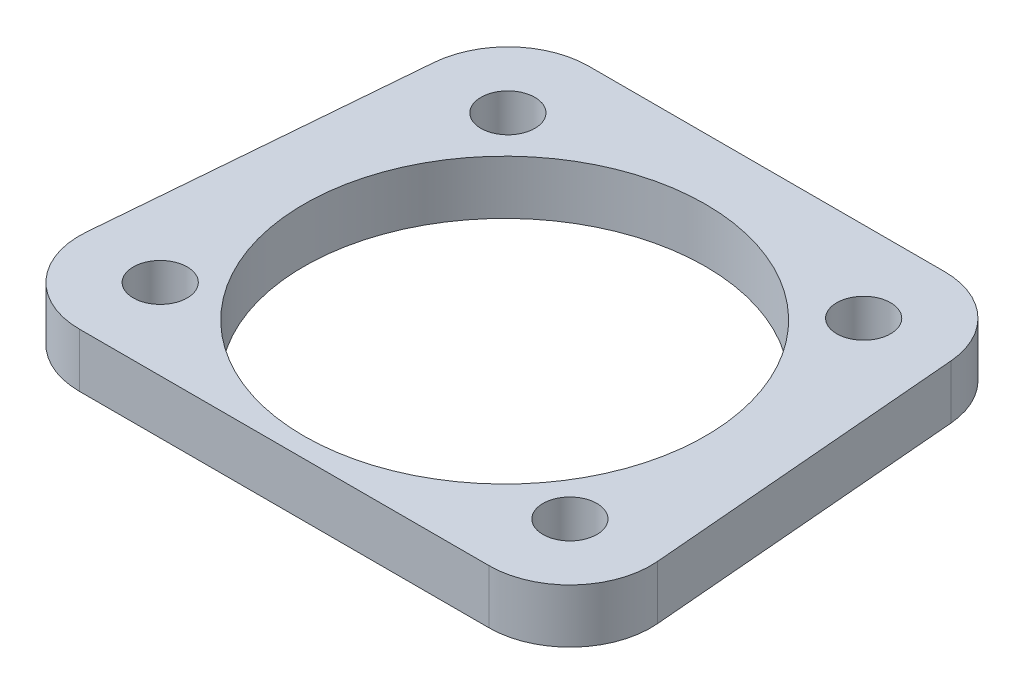
ISO-10303-21;
HEADER;
FILE_DESCRIPTION(('STEP AP214'),'2;1');
FILE_NAME('part.step','',(''),(''),'','','');
FILE_SCHEMA(('AUTOMOTIVE_DESIGN { 1 0 10303 214 1 1 1 1 }'));
ENDSEC;
DATA;
#1=APPLICATION_CONTEXT('core data for automotive mechanical design processes');
#2=APPLICATION_PROTOCOL_DEFINITION('international standard','automotive_design',2000,#1);
#3=PRODUCT_CONTEXT('',#1,'mechanical');
#4=PRODUCT('Part','Part','',(#3));
#5=PRODUCT_RELATED_PRODUCT_CATEGORY('part','',(#4));
#6=PRODUCT_DEFINITION_FORMATION('','',#4);
#7=PRODUCT_DEFINITION_CONTEXT('part definition',#1,'design');
#8=PRODUCT_DEFINITION('design','',#6,#7);
#9=PRODUCT_DEFINITION_SHAPE('','',#8);
#10=(LENGTH_UNIT() NAMED_UNIT(*) SI_UNIT(.MILLI.,.METRE.));
#11=(NAMED_UNIT(*) PLANE_ANGLE_UNIT() SI_UNIT($,.RADIAN.));
#12=(NAMED_UNIT(*) SI_UNIT($,.STERADIAN.) SOLID_ANGLE_UNIT());
#13=UNCERTAINTY_MEASURE_WITH_UNIT(LENGTH_MEASURE(1.E-05),#10,'distance_accuracy_value','');
#14=(GEOMETRIC_REPRESENTATION_CONTEXT(3) GLOBAL_UNCERTAINTY_ASSIGNED_CONTEXT((#13)) GLOBAL_UNIT_ASSIGNED_CONTEXT((#10,
#11,#12)) REPRESENTATION_CONTEXT('',''));
#15=CARTESIAN_POINT('',(0.,0.,0.));
#16=DIRECTION('',(0.,0.,1.));
#17=DIRECTION('',(1.,0.,0.));
#18=AXIS2_PLACEMENT_3D('',#15,#16,#17);
#19=CARTESIAN_POINT('',(-50.2691426447939,10.,-4.22498993905971));
#20=DIRECTION('',(0.996486621477541,0.,0.0837520938023445));
#21=DIRECTION('',(0.0837520938023445,0.,-0.996486621477541));
#22=AXIS2_PLACEMENT_3D('',#19,#20,#21);
#23=PLANE('',#22);
#24=DIRECTION('',(-0.0837520938023445,0.,0.996486621477541));
#25=VECTOR('',#24,1.);
#26=CARTESIAN_POINT('',(-50.2691426447939,0.,-4.22498993905971));
#27=LINE('',#26,#25);
#28=CARTESIAN_POINT('',(-47.9472993221631,0.,-31.8503984885919));
#29=VERTEX_POINT('',#28);
#30=CARTESIAN_POINT('',(-52.9472993221631,0.,27.6398528136173));
#31=VERTEX_POINT('',#30);
#32=EDGE_CURVE('E145',#29,#31,#27,.T.);
#33=ORIENTED_EDGE('',*,*,#32,.T.);
#34=DIRECTION('',(0.,-1.,0.));
#35=VECTOR('',#34,1.);
#36=CARTESIAN_POINT('',(-52.9472993221631,10.,27.6398528136173));
#37=LINE('',#36,#35);
#38=CARTESIAN_POINT('',(-52.9472993221631,10.,27.6398528136173));
#39=VERTEX_POINT('',#38);
#40=EDGE_CURVE('E11',#39,#31,#37,.T.);
#41=ORIENTED_EDGE('',*,*,#40,.F.);
#42=DIRECTION('',(-0.0837520938023445,0.,0.996486621477541));
#43=VECTOR('',#42,1.);
#44=CARTESIAN_POINT('',(-50.2691426447939,10.,-4.22498993905971));
#45=LINE('',#44,#43);
#46=CARTESIAN_POINT('',(-47.9472993221631,10.,-31.8503984885919));
#47=VERTEX_POINT('',#46);
#48=EDGE_CURVE('E191',#47,#39,#45,.T.);
#49=ORIENTED_EDGE('',*,*,#48,.F.);
#50=DIRECTION('',(0.,-1.,0.));
#51=VECTOR('',#50,1.);
#52=CARTESIAN_POINT('',(-47.9472993221631,10.,-31.8503984885919));
#53=LINE('',#52,#51);
#54=EDGE_CURVE('E126',#47,#29,#53,.T.);
#55=ORIENTED_EDGE('',*,*,#54,.T.);
#56=EDGE_LOOP('',(#33,#41,#49,#55));
#57=FACE_BOUND('',#56,.T.);
#58=ADVANCED_FACE('F35',(#57),#23,.F.);
#59=CARTESIAN_POINT('',(-38.,10.,28.8961342206525));
#60=DIRECTION('',(0.,-1.,0.));
#61=DIRECTION('',(0.,0.,-1.));
#62=AXIS2_PLACEMENT_3D('',#59,#60,#61);
#63=CYLINDRICAL_SURFACE('',#62,15.);
#64=CARTESIAN_POINT('',(-38.,0.,28.8961342206525));
#65=DIRECTION('',(0.,1.,0.));
#66=DIRECTION('',(0.,0.,1.));
#67=AXIS2_PLACEMENT_3D('',#64,#65,#66);
#68=CIRCLE('',#67,15.);
#69=CARTESIAN_POINT('',(-38.,0.,43.8961342206525));
#70=VERTEX_POINT('',#69);
#71=EDGE_CURVE('E148',#31,#70,#68,.T.);
#72=ORIENTED_EDGE('',*,*,#71,.T.);
#73=DIRECTION('',(0.,-1.,0.));
#74=VECTOR('',#73,1.);
#75=CARTESIAN_POINT('',(-38.,10.,43.8961342206525));
#76=LINE('',#75,#74);
#77=CARTESIAN_POINT('',(-38.,10.,43.8961342206525));
#78=VERTEX_POINT('',#77);
#79=EDGE_CURVE('E44',#78,#70,#76,.T.);
#80=ORIENTED_EDGE('',*,*,#79,.F.);
#81=CARTESIAN_POINT('',(-38.,10.,28.8961342206525));
#82=DIRECTION('',(0.,1.,0.));
#83=DIRECTION('',(0.,0.,1.));
#84=AXIS2_PLACEMENT_3D('',#81,#82,#83);
#85=CIRCLE('',#84,15.);
#86=EDGE_CURVE('E91',#39,#78,#85,.T.);
#87=ORIENTED_EDGE('',*,*,#86,.F.);
#88=ORIENTED_EDGE('',*,*,#40,.T.);
#89=EDGE_LOOP('',(#72,#80,#87,#88));
#90=FACE_BOUND('',#89,.T.);
#91=ADVANCED_FACE('F237',(#90),#63,.T.);
#92=CARTESIAN_POINT('',(0.,10.,43.8961342206525));
#93=DIRECTION('',(0.,0.,-1.));
#94=DIRECTION('',(-1.,0.,0.));
#95=AXIS2_PLACEMENT_3D('',#92,#93,#94);
#96=PLANE('',#95);
#97=DIRECTION('',(1.,0.,0.));
#98=VECTOR('',#97,1.);
#99=CARTESIAN_POINT('',(0.,0.,43.8961342206525));
#100=LINE('',#99,#98);
#101=CARTESIAN_POINT('',(38.,0.,43.8961342206525));
#102=VERTEX_POINT('',#101);
#103=EDGE_CURVE('E150',#70,#102,#100,.T.);
#104=ORIENTED_EDGE('',*,*,#103,.T.);
#105=DIRECTION('',(0.,-1.,0.));
#106=VECTOR('',#105,1.);
#107=CARTESIAN_POINT('',(38.,10.,43.8961342206525));
#108=LINE('',#107,#106);
#109=CARTESIAN_POINT('',(38.,10.,43.8961342206525));
#110=VERTEX_POINT('',#109);
#111=EDGE_CURVE('E168',#110,#102,#108,.T.);
#112=ORIENTED_EDGE('',*,*,#111,.F.);
#113=DIRECTION('',(1.,0.,0.));
#114=VECTOR('',#113,1.);
#115=CARTESIAN_POINT('',(0.,10.,43.8961342206525));
#116=LINE('',#115,#114);
#117=EDGE_CURVE('E176',#78,#110,#116,.T.);
#118=ORIENTED_EDGE('',*,*,#117,.F.);
#119=ORIENTED_EDGE('',*,*,#79,.T.);
#120=EDGE_LOOP('',(#104,#112,#118,#119));
#121=FACE_BOUND('',#120,.T.);
#122=ADVANCED_FACE('F174',(#121),#96,.F.);
#123=CARTESIAN_POINT('',(38.,10.,28.8961342206525));
#124=DIRECTION('',(0.,-1.,0.));
#125=DIRECTION('',(0.,0.,-1.));
#126=AXIS2_PLACEMENT_3D('',#123,#124,#125);
#127=CYLINDRICAL_SURFACE('',#126,15.);
#128=CARTESIAN_POINT('',(38.,0.,28.8961342206525));
#129=DIRECTION('',(0.,1.,0.));
#130=DIRECTION('',(0.,0.,1.));
#131=AXIS2_PLACEMENT_3D('',#128,#129,#130);
#132=CIRCLE('',#131,15.);
#133=CARTESIAN_POINT('',(52.9472993221631,0.,27.6398528136173));
#134=VERTEX_POINT('',#133);
#135=EDGE_CURVE('E152',#102,#134,#132,.T.);
#136=ORIENTED_EDGE('',*,*,#135,.T.);
#137=DIRECTION('',(0.,-1.,0.));
#138=VECTOR('',#137,1.);
#139=CARTESIAN_POINT('',(52.9472993221631,10.,27.6398528136173));
#140=LINE('',#139,#138);
#141=CARTESIAN_POINT('',(52.9472993221631,10.,27.6398528136173));
#142=VERTEX_POINT('',#141);
#143=EDGE_CURVE('E166',#142,#134,#140,.T.);
#144=ORIENTED_EDGE('',*,*,#143,.F.);
#145=CARTESIAN_POINT('',(38.,10.,28.8961342206525));
#146=DIRECTION('',(0.,1.,0.));
#147=DIRECTION('',(0.,0.,1.));
#148=AXIS2_PLACEMENT_3D('',#145,#146,#147);
#149=CIRCLE('',#148,15.);
#150=EDGE_CURVE('E186',#110,#142,#149,.T.);
#151=ORIENTED_EDGE('',*,*,#150,.F.);
#152=ORIENTED_EDGE('',*,*,#111,.T.);
#153=EDGE_LOOP('',(#136,#144,#151,#152));
#154=FACE_BOUND('',#153,.T.);
#155=ADVANCED_FACE('F184',(#154),#127,.T.);
#156=CARTESIAN_POINT('',(50.2691426447939,10.,-4.22498993905974));
#157=DIRECTION('',(0.996486621477541,0.,-0.0837520938023451));
#158=DIRECTION('',(-0.0837520938023451,0.,-0.996486621477541));
#159=AXIS2_PLACEMENT_3D('',#156,#157,#158);
#160=PLANE('',#159);
#161=DIRECTION('',(0.0837520938023451,0.,0.996486621477541));
#162=VECTOR('',#161,1.);
#163=CARTESIAN_POINT('',(50.2691426447939,0.,-4.22498993905974));
#164=LINE('',#163,#162);
#165=CARTESIAN_POINT('',(47.9472993221631,0.,-31.8503984885919));
#166=VERTEX_POINT('',#165);
#167=EDGE_CURVE('E155',#166,#134,#164,.T.);
#168=ORIENTED_EDGE('',*,*,#167,.F.);
#169=DIRECTION('',(0.,-1.,0.));
#170=VECTOR('',#169,1.);
#171=CARTESIAN_POINT('',(47.9472993221631,10.,-31.8503984885919));
#172=LINE('',#171,#170);
#173=CARTESIAN_POINT('',(47.9472993221631,10.,-31.8503984885919));
#174=VERTEX_POINT('',#173);
#175=EDGE_CURVE('E122',#174,#166,#172,.T.);
#176=ORIENTED_EDGE('',*,*,#175,.F.);
#177=DIRECTION('',(0.0837520938023451,0.,0.996486621477541));
#178=VECTOR('',#177,1.);
#179=CARTESIAN_POINT('',(50.2691426447939,10.,-4.22498993905974));
#180=LINE('',#179,#178);
#181=EDGE_CURVE('E111',#174,#142,#180,.T.);
#182=ORIENTED_EDGE('',*,*,#181,.T.);
#183=ORIENTED_EDGE('',*,*,#143,.T.);
#184=EDGE_LOOP('',(#168,#176,#182,#183));
#185=FACE_BOUND('',#184,.T.);
#186=ADVANCED_FACE('F276',(#185),#160,.T.);
#187=CARTESIAN_POINT('',(33.,10.,-30.5941170815567));
#188=DIRECTION('',(0.,-1.,0.));
#189=DIRECTION('',(0.,0.,-1.));
#190=AXIS2_PLACEMENT_3D('',#187,#188,#189);
#191=CYLINDRICAL_SURFACE('',#190,15.);
#192=CARTESIAN_POINT('',(33.,0.,-30.5941170815567));
#193=DIRECTION('',(0.,1.,0.));
#194=DIRECTION('',(0.,0.,1.));
#195=AXIS2_PLACEMENT_3D('',#192,#193,#194);
#196=CIRCLE('',#195,15.);
#197=CARTESIAN_POINT('',(33.,0.,-45.5941170815567));
#198=VERTEX_POINT('',#197);
#199=EDGE_CURVE('E118',#166,#198,#196,.T.);
#200=ORIENTED_EDGE('',*,*,#199,.T.);
#201=DIRECTION('',(0.,-1.,0.));
#202=VECTOR('',#201,1.);
#203=CARTESIAN_POINT('',(33.,10.,-45.5941170815567));
#204=LINE('',#203,#202);
#205=CARTESIAN_POINT('',(33.,10.,-45.5941170815567));
#206=VERTEX_POINT('',#205);
#207=EDGE_CURVE('E115',#206,#198,#204,.T.);
#208=ORIENTED_EDGE('',*,*,#207,.F.);
#209=CARTESIAN_POINT('',(33.,10.,-30.5941170815567));
#210=DIRECTION('',(0.,1.,0.));
#211=DIRECTION('',(0.,0.,1.));
#212=AXIS2_PLACEMENT_3D('',#209,#210,#211);
#213=CIRCLE('',#212,15.);
#214=EDGE_CURVE('E105',#174,#206,#213,.T.);
#215=ORIENTED_EDGE('',*,*,#214,.F.);
#216=ORIENTED_EDGE('',*,*,#175,.T.);
#217=EDGE_LOOP('',(#200,#208,#215,#216));
#218=FACE_BOUND('',#217,.T.);
#219=ADVANCED_FACE('F116',(#218),#191,.T.);
#220=CARTESIAN_POINT('',(0.,10.,-45.5941170815567));
#221=DIRECTION('',(0.,0.,-1.));
#222=DIRECTION('',(-1.,0.,0.));
#223=AXIS2_PLACEMENT_3D('',#220,#221,#222);
#224=PLANE('',#223);
#225=DIRECTION('',(1.,0.,0.));
#226=VECTOR('',#225,1.);
#227=CARTESIAN_POINT('',(0.,0.,-45.5941170815567));
#228=LINE('',#227,#226);
#229=CARTESIAN_POINT('',(-33.,0.,-45.5941170815567));
#230=VERTEX_POINT('',#229);
#231=EDGE_CURVE('E159',#230,#198,#228,.T.);
#232=ORIENTED_EDGE('',*,*,#231,.F.);
#233=DIRECTION('',(0.,-1.,0.));
#234=VECTOR('',#233,1.);
#235=CARTESIAN_POINT('',(-33.,10.,-45.5941170815567));
#236=LINE('',#235,#234);
#237=CARTESIAN_POINT('',(-33.,10.,-45.5941170815567));
#238=VERTEX_POINT('',#237);
#239=EDGE_CURVE('E80',#238,#230,#236,.T.);
#240=ORIENTED_EDGE('',*,*,#239,.F.);
#241=DIRECTION('',(1.,0.,0.));
#242=VECTOR('',#241,1.);
#243=CARTESIAN_POINT('',(0.,10.,-45.5941170815567));
#244=LINE('',#243,#242);
#245=EDGE_CURVE('E109',#238,#206,#244,.T.);
#246=ORIENTED_EDGE('',*,*,#245,.T.);
#247=ORIENTED_EDGE('',*,*,#207,.T.);
#248=EDGE_LOOP('',(#232,#240,#246,#247));
#249=FACE_BOUND('',#248,.T.);
#250=ADVANCED_FACE('F124',(#249),#224,.T.);
#251=CARTESIAN_POINT('',(-38.,10.,28.8961342206525));
#252=DIRECTION('',(0.,-1.,0.));
#253=DIRECTION('',(0.,0.,-1.));
#254=AXIS2_PLACEMENT_3D('',#251,#252,#253);
#255=CYLINDRICAL_SURFACE('',#254,5.);
#256=CARTESIAN_POINT('',(-38.,10.,28.8961342206525));
#257=DIRECTION('',(0.,1.,0.));
#258=DIRECTION('',(0.,0.,1.));
#259=AXIS2_PLACEMENT_3D('',#256,#257,#258);
#260=CIRCLE('',#259,5.);
#261=CARTESIAN_POINT('',(-38.,10.,33.8961342206525));
#262=VERTEX_POINT('',#261);
#263=EDGE_CURVE('E193',#262,#262,#260,.T.);
#264=ORIENTED_EDGE('',*,*,#263,.T.);
#265=EDGE_LOOP('',(#264));
#266=FACE_BOUND('',#265,.T.);
#267=CARTESIAN_POINT('',(-38.,0.,28.8961342206525));
#268=DIRECTION('',(0.,1.,0.));
#269=DIRECTION('',(0.,0.,1.));
#270=AXIS2_PLACEMENT_3D('',#267,#268,#269);
#271=CIRCLE('',#270,5.);
#272=CARTESIAN_POINT('',(-38.,0.,33.8961342206525));
#273=VERTEX_POINT('',#272);
#274=EDGE_CURVE('E142',#273,#273,#271,.T.);
#275=ORIENTED_EDGE('',*,*,#274,.F.);
#276=EDGE_LOOP('',(#275));
#277=FACE_BOUND('',#276,.T.);
#278=ADVANCED_FACE('F222',(#266,#277),#255,.F.);
#279=CARTESIAN_POINT('',(38.,10.,28.8961342206525));
#280=DIRECTION('',(0.,-1.,0.));
#281=DIRECTION('',(0.,0.,-1.));
#282=AXIS2_PLACEMENT_3D('',#279,#280,#281);
#283=CYLINDRICAL_SURFACE('',#282,4.99999999999999);
#284=CARTESIAN_POINT('',(38.,10.,28.8961342206525));
#285=DIRECTION('',(0.,1.,0.));
#286=DIRECTION('',(0.,0.,1.));
#287=AXIS2_PLACEMENT_3D('',#284,#285,#286);
#288=CIRCLE('',#287,4.99999999999999);
#289=CARTESIAN_POINT('',(38.,10.,33.8961342206525));
#290=VERTEX_POINT('',#289);
#291=EDGE_CURVE('E196',#290,#290,#288,.T.);
#292=ORIENTED_EDGE('',*,*,#291,.T.);
#293=EDGE_LOOP('',(#292));
#294=FACE_BOUND('',#293,.T.);
#295=CARTESIAN_POINT('',(38.,0.,28.8961342206525));
#296=DIRECTION('',(0.,1.,0.));
#297=DIRECTION('',(0.,0.,1.));
#298=AXIS2_PLACEMENT_3D('',#295,#296,#297);
#299=CIRCLE('',#298,4.99999999999999);
#300=CARTESIAN_POINT('',(38.,0.,33.8961342206525));
#301=VERTEX_POINT('',#300);
#302=EDGE_CURVE('E139',#301,#301,#299,.T.);
#303=ORIENTED_EDGE('',*,*,#302,.F.);
#304=EDGE_LOOP('',(#303));
#305=FACE_BOUND('',#304,.T.);
#306=ADVANCED_FACE('F225',(#294,#305),#283,.F.);
#307=CARTESIAN_POINT('',(33.,10.,-30.5941170815567));
#308=DIRECTION('',(0.,-1.,0.));
#309=DIRECTION('',(0.,0.,-1.));
#310=AXIS2_PLACEMENT_3D('',#307,#308,#309);
#311=CYLINDRICAL_SURFACE('',#310,5.00000000000001);
#312=CARTESIAN_POINT('',(33.,10.,-30.5941170815567));
#313=DIRECTION('',(0.,1.,0.));
#314=DIRECTION('',(0.,0.,1.));
#315=AXIS2_PLACEMENT_3D('',#312,#313,#314);
#316=CIRCLE('',#315,5.00000000000001);
#317=CARTESIAN_POINT('',(33.,10.,-25.5941170815567));
#318=VERTEX_POINT('',#317);
#319=EDGE_CURVE('E199',#318,#318,#316,.T.);
#320=ORIENTED_EDGE('',*,*,#319,.T.);
#321=EDGE_LOOP('',(#320));
#322=FACE_BOUND('',#321,.T.);
#323=CARTESIAN_POINT('',(33.,0.,-30.5941170815567));
#324=DIRECTION('',(0.,1.,0.));
#325=DIRECTION('',(0.,0.,1.));
#326=AXIS2_PLACEMENT_3D('',#323,#324,#325);
#327=CIRCLE('',#326,5.00000000000001);
#328=CARTESIAN_POINT('',(33.,0.,-25.5941170815567));
#329=VERTEX_POINT('',#328);
#330=EDGE_CURVE('E136',#329,#329,#327,.T.);
#331=ORIENTED_EDGE('',*,*,#330,.F.);
#332=EDGE_LOOP('',(#331));
#333=FACE_BOUND('',#332,.T.);
#334=ADVANCED_FACE('F248',(#322,#333),#311,.F.);
#335=CARTESIAN_POINT('',(-33.,10.,-30.5941170815567));
#336=DIRECTION('',(0.,-1.,0.));
#337=DIRECTION('',(0.,0.,-1.));
#338=AXIS2_PLACEMENT_3D('',#335,#336,#337);
#339=CYLINDRICAL_SURFACE('',#338,5.);
#340=CARTESIAN_POINT('',(-33.,10.,-30.5941170815567));
#341=DIRECTION('',(0.,1.,0.));
#342=DIRECTION('',(0.,0.,1.));
#343=AXIS2_PLACEMENT_3D('',#340,#341,#342);
#344=CIRCLE('',#343,5.);
#345=CARTESIAN_POINT('',(-33.,10.,-25.5941170815567));
#346=VERTEX_POINT('',#345);
#347=EDGE_CURVE('E202',#346,#346,#344,.T.);
#348=ORIENTED_EDGE('',*,*,#347,.T.);
#349=EDGE_LOOP('',(#348));
#350=FACE_BOUND('',#349,.T.);
#351=CARTESIAN_POINT('',(-33.,0.,-30.5941170815567));
#352=DIRECTION('',(0.,1.,0.));
#353=DIRECTION('',(0.,0.,1.));
#354=AXIS2_PLACEMENT_3D('',#351,#352,#353);
#355=CIRCLE('',#354,5.);
#356=CARTESIAN_POINT('',(-33.,0.,-25.5941170815567));
#357=VERTEX_POINT('',#356);
#358=EDGE_CURVE('E133',#357,#357,#355,.T.);
#359=ORIENTED_EDGE('',*,*,#358,.F.);
#360=EDGE_LOOP('',(#359));
#361=FACE_BOUND('',#360,.T.);
#362=ADVANCED_FACE('F251',(#350,#361),#339,.F.);
#363=CARTESIAN_POINT('',(0.,10.,3.));
#364=DIRECTION('',(0.,-1.,0.));
#365=DIRECTION('',(0.,0.,-1.));
#366=AXIS2_PLACEMENT_3D('',#363,#364,#365);
#367=CYLINDRICAL_SURFACE('',#366,37.25);
#368=CARTESIAN_POINT('',(0.,10.,3.));
#369=DIRECTION('',(0.,1.,0.));
#370=DIRECTION('',(0.,0.,1.));
#371=AXIS2_PLACEMENT_3D('',#368,#369,#370);
#372=CIRCLE('',#371,37.25);
#373=CARTESIAN_POINT('',(0.,10.,40.25));
#374=VERTEX_POINT('',#373);
#375=EDGE_CURVE('E162',#374,#374,#372,.T.);
#376=ORIENTED_EDGE('',*,*,#375,.T.);
#377=EDGE_LOOP('',(#376));
#378=FACE_BOUND('',#377,.T.);
#379=CARTESIAN_POINT('',(0.,0.,3.));
#380=DIRECTION('',(0.,1.,0.));
#381=DIRECTION('',(0.,0.,1.));
#382=AXIS2_PLACEMENT_3D('',#379,#380,#381);
#383=CIRCLE('',#382,37.25);
#384=CARTESIAN_POINT('',(0.,0.,40.25));
#385=VERTEX_POINT('',#384);
#386=EDGE_CURVE('E130',#385,#385,#383,.T.);
#387=ORIENTED_EDGE('',*,*,#386,.F.);
#388=EDGE_LOOP('',(#387));
#389=FACE_BOUND('',#388,.T.);
#390=ADVANCED_FACE('F37',(#378,#389),#367,.F.);
#391=CARTESIAN_POINT('',(-33.,10.,-30.5941170815567));
#392=DIRECTION('',(0.,-1.,0.));
#393=DIRECTION('',(0.,0.,-1.));
#394=AXIS2_PLACEMENT_3D('',#391,#392,#393);
#395=CYLINDRICAL_SURFACE('',#394,15.);
#396=CARTESIAN_POINT('',(-33.,0.,-30.5941170815567));
#397=DIRECTION('',(0.,1.,0.));
#398=DIRECTION('',(0.,0.,1.));
#399=AXIS2_PLACEMENT_3D('',#396,#397,#398);
#400=CIRCLE('',#399,15.);
#401=EDGE_CURVE('E83',#230,#29,#400,.T.);
#402=ORIENTED_EDGE('',*,*,#401,.T.);
#403=ORIENTED_EDGE('',*,*,#54,.F.);
#404=CARTESIAN_POINT('',(-33.,10.,-30.5941170815567));
#405=DIRECTION('',(0.,1.,0.));
#406=DIRECTION('',(0.,0.,1.));
#407=AXIS2_PLACEMENT_3D('',#404,#405,#406);
#408=CIRCLE('',#407,15.);
#409=EDGE_CURVE('E52',#238,#47,#408,.T.);
#410=ORIENTED_EDGE('',*,*,#409,.F.);
#411=ORIENTED_EDGE('',*,*,#239,.T.);
#412=EDGE_LOOP('',(#402,#403,#410,#411));
#413=FACE_BOUND('',#412,.T.);
#414=ADVANCED_FACE('F212',(#413),#395,.T.);
#415=CARTESIAN_POINT('',(0.,10.,0.));
#416=DIRECTION('',(0.,1.,0.));
#417=DIRECTION('',(0.,0.,1.));
#418=AXIS2_PLACEMENT_3D('',#415,#416,#417);
#419=PLANE('',#418);
#420=ORIENTED_EDGE('',*,*,#375,.F.);
#421=EDGE_LOOP('',(#420));
#422=FACE_BOUND('',#421,.T.);
#423=ORIENTED_EDGE('',*,*,#347,.F.);
#424=EDGE_LOOP('',(#423));
#425=FACE_BOUND('',#424,.T.);
#426=ORIENTED_EDGE('',*,*,#319,.F.);
#427=EDGE_LOOP('',(#426));
#428=FACE_BOUND('',#427,.T.);
#429=ORIENTED_EDGE('',*,*,#291,.F.);
#430=EDGE_LOOP('',(#429));
#431=FACE_BOUND('',#430,.T.);
#432=ORIENTED_EDGE('',*,*,#263,.F.);
#433=EDGE_LOOP('',(#432));
#434=FACE_BOUND('',#433,.T.);
#435=ORIENTED_EDGE('',*,*,#48,.T.);
#436=ORIENTED_EDGE('',*,*,#86,.T.);
#437=ORIENTED_EDGE('',*,*,#117,.T.);
#438=ORIENTED_EDGE('',*,*,#150,.T.);
#439=ORIENTED_EDGE('',*,*,#181,.F.);
#440=ORIENTED_EDGE('',*,*,#214,.T.);
#441=ORIENTED_EDGE('',*,*,#245,.F.);
#442=ORIENTED_EDGE('',*,*,#409,.T.);
#443=EDGE_LOOP('',(#435,#436,#437,#438,#439,#440,#441,#442));
#444=FACE_BOUND('',#443,.T.);
#445=ADVANCED_FACE('F107',(#422,#425,#428,#431,#434,#444),#419,.T.);
#446=CARTESIAN_POINT('',(0.,0.,0.));
#447=DIRECTION('',(0.,1.,0.));
#448=DIRECTION('',(0.,0.,1.));
#449=AXIS2_PLACEMENT_3D('',#446,#447,#448);
#450=PLANE('',#449);
#451=ORIENTED_EDGE('',*,*,#386,.T.);
#452=EDGE_LOOP('',(#451));
#453=FACE_BOUND('',#452,.T.);
#454=ORIENTED_EDGE('',*,*,#358,.T.);
#455=EDGE_LOOP('',(#454));
#456=FACE_BOUND('',#455,.T.);
#457=ORIENTED_EDGE('',*,*,#330,.T.);
#458=EDGE_LOOP('',(#457));
#459=FACE_BOUND('',#458,.T.);
#460=ORIENTED_EDGE('',*,*,#302,.T.);
#461=EDGE_LOOP('',(#460));
#462=FACE_BOUND('',#461,.T.);
#463=ORIENTED_EDGE('',*,*,#274,.T.);
#464=EDGE_LOOP('',(#463));
#465=FACE_BOUND('',#464,.T.);
#466=ORIENTED_EDGE('',*,*,#32,.F.);
#467=ORIENTED_EDGE('',*,*,#401,.F.);
#468=ORIENTED_EDGE('',*,*,#231,.T.);
#469=ORIENTED_EDGE('',*,*,#199,.F.);
#470=ORIENTED_EDGE('',*,*,#167,.T.);
#471=ORIENTED_EDGE('',*,*,#135,.F.);
#472=ORIENTED_EDGE('',*,*,#103,.F.);
#473=ORIENTED_EDGE('',*,*,#71,.F.);
#474=EDGE_LOOP('',(#466,#467,#468,#469,#470,#471,#472,#473));
#475=FACE_BOUND('',#474,.T.);
#476=ADVANCED_FACE('F180',(#453,#456,#459,#462,#465,#475),#450,.F.);
#477=CLOSED_SHELL('',(#58,#91,#122,#155,#186,#219,#250,#278,#306,#334,#362,#390,#414,#445,#476));
#478=MANIFOLD_SOLID_BREP('B2',#477);
#479=ADVANCED_BREP_SHAPE_REPRESENTATION('',(#18,#478),#14);
#480=SHAPE_DEFINITION_REPRESENTATION(#9,#479);
ENDSEC;
END-ISO-10303-21;
